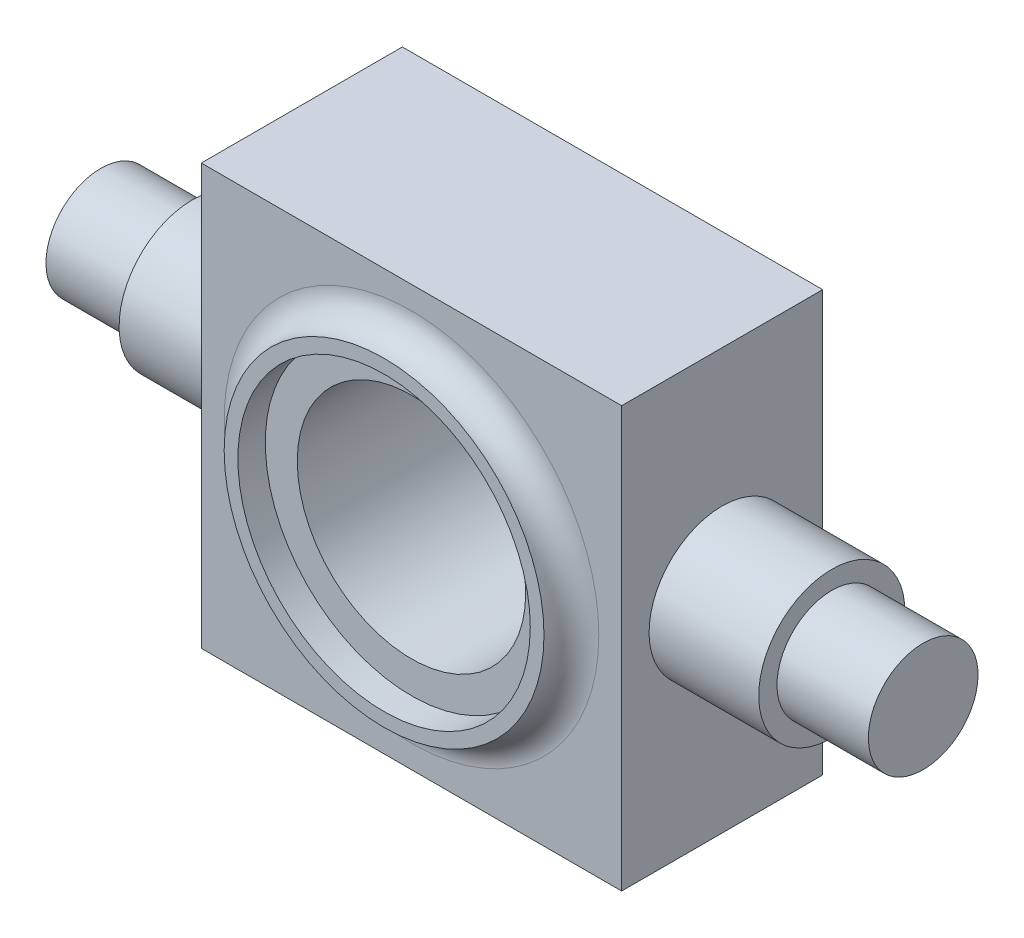
ISO-10303-21;
HEADER;
FILE_DESCRIPTION(('STEP AP214'),'2;1');
FILE_NAME('part.step','',(''),(''),'','','');
FILE_SCHEMA(('AUTOMOTIVE_DESIGN { 1 0 10303 214 1 1 1 1 }'));
ENDSEC;
DATA;
#1=APPLICATION_CONTEXT('core data for automotive mechanical design processes');
#2=APPLICATION_PROTOCOL_DEFINITION('international standard','automotive_design',2000,#1);
#3=PRODUCT_CONTEXT('',#1,'mechanical');
#4=PRODUCT('Part','Part','',(#3));
#5=PRODUCT_RELATED_PRODUCT_CATEGORY('part','',(#4));
#6=PRODUCT_DEFINITION_FORMATION('','',#4);
#7=PRODUCT_DEFINITION_CONTEXT('part definition',#1,'design');
#8=PRODUCT_DEFINITION('design','',#6,#7);
#9=PRODUCT_DEFINITION_SHAPE('','',#8);
#10=(LENGTH_UNIT() NAMED_UNIT(*) SI_UNIT(.MILLI.,.METRE.));
#11=(NAMED_UNIT(*) PLANE_ANGLE_UNIT() SI_UNIT($,.RADIAN.));
#12=(NAMED_UNIT(*) SI_UNIT($,.STERADIAN.) SOLID_ANGLE_UNIT());
#13=UNCERTAINTY_MEASURE_WITH_UNIT(LENGTH_MEASURE(1.E-05),#10,'distance_accuracy_value','');
#14=(GEOMETRIC_REPRESENTATION_CONTEXT(3) GLOBAL_UNCERTAINTY_ASSIGNED_CONTEXT((#13)) GLOBAL_UNIT_ASSIGNED_CONTEXT((#10,
#11,#12)) REPRESENTATION_CONTEXT('',''));
#15=CARTESIAN_POINT('',(0.,0.,0.));
#16=DIRECTION('',(0.,0.,1.));
#17=DIRECTION('',(1.,0.,0.));
#18=AXIS2_PLACEMENT_3D('',#15,#16,#17);
#19=CARTESIAN_POINT('',(0.,0.,-11.));
#20=DIRECTION('',(0.,0.,1.));
#21=DIRECTION('',(1.,0.,0.));
#22=AXIS2_PLACEMENT_3D('',#19,#20,#21);
#23=PLANE('',#22);
#24=CARTESIAN_POINT('',(0.,0.,-11.));
#25=DIRECTION('',(0.,0.,1.));
#26=DIRECTION('',(1.,0.,0.));
#27=AXIS2_PLACEMENT_3D('',#24,#25,#26);
#28=CIRCLE('',#27,12.5);
#29=CARTESIAN_POINT('',(12.5,0.,-11.));
#30=VERTEX_POINT('',#29);
#31=EDGE_CURVE('E186',#30,#30,#28,.T.);
#32=ORIENTED_EDGE('',*,*,#31,.T.);
#33=EDGE_LOOP('',(#32));
#34=FACE_BOUND('',#33,.T.);
#35=CARTESIAN_POINT('',(0.,0.,-11.));
#36=DIRECTION('',(0.,0.,1.));
#37=DIRECTION('',(1.,0.,0.));
#38=AXIS2_PLACEMENT_3D('',#35,#36,#37);
#39=CIRCLE('',#38,16.);
#40=CARTESIAN_POINT('',(16.,0.,-11.));
#41=VERTEX_POINT('',#40);
#42=EDGE_CURVE('E118',#41,#41,#39,.T.);
#43=ORIENTED_EDGE('',*,*,#42,.F.);
#44=EDGE_LOOP('',(#43));
#45=FACE_BOUND('',#44,.T.);
#46=ADVANCED_FACE('F37',(#34,#45),#23,.F.);
#47=CARTESIAN_POINT('',(0.,0.,11.));
#48=DIRECTION('',(0.,0.,1.));
#49=DIRECTION('',(1.,0.,0.));
#50=AXIS2_PLACEMENT_3D('',#47,#48,#49);
#51=PLANE('',#50);
#52=CARTESIAN_POINT('',(0.,0.,11.));
#53=DIRECTION('',(0.,0.,1.));
#54=DIRECTION('',(1.,0.,0.));
#55=AXIS2_PLACEMENT_3D('',#52,#53,#54);
#56=CIRCLE('',#55,20.5);
#57=CARTESIAN_POINT('',(20.5,0.,11.));
#58=VERTEX_POINT('',#57);
#59=EDGE_CURVE('E11',#58,#58,#56,.F.);
#60=ORIENTED_EDGE('',*,*,#59,.T.);
#61=EDGE_LOOP('',(#60));
#62=FACE_BOUND('',#61,.T.);
#63=DIRECTION('',(0.,1.,0.));
#64=VECTOR('',#63,1.);
#65=CARTESIAN_POINT('',(23.,23.,11.));
#66=LINE('',#65,#64);
#67=CARTESIAN_POINT('',(23.,-23.,11.));
#68=VERTEX_POINT('',#67);
#69=CARTESIAN_POINT('',(23.,23.,11.));
#70=VERTEX_POINT('',#69);
#71=EDGE_CURVE('E90',#68,#70,#66,.T.);
#72=ORIENTED_EDGE('',*,*,#71,.T.);
#73=DIRECTION('',(-1.,0.,0.));
#74=VECTOR('',#73,1.);
#75=CARTESIAN_POINT('',(-23.,23.,11.));
#76=LINE('',#75,#74);
#77=CARTESIAN_POINT('',(-23.,23.,11.));
#78=VERTEX_POINT('',#77);
#79=EDGE_CURVE('E85',#70,#78,#76,.T.);
#80=ORIENTED_EDGE('',*,*,#79,.T.);
#81=DIRECTION('',(0.,-1.,0.));
#82=VECTOR('',#81,1.);
#83=CARTESIAN_POINT('',(-23.,23.,11.));
#84=LINE('',#83,#82);
#85=CARTESIAN_POINT('',(-23.,-23.,11.));
#86=VERTEX_POINT('',#85);
#87=EDGE_CURVE('E88',#78,#86,#84,.T.);
#88=ORIENTED_EDGE('',*,*,#87,.T.);
#89=DIRECTION('',(1.,0.,0.));
#90=VECTOR('',#89,1.);
#91=CARTESIAN_POINT('',(-23.,-23.,11.));
#92=LINE('',#91,#90);
#93=EDGE_CURVE('E54',#86,#68,#92,.T.);
#94=ORIENTED_EDGE('',*,*,#93,.T.);
#95=EDGE_LOOP('',(#72,#80,#88,#94));
#96=FACE_BOUND('',#95,.T.);
#97=ADVANCED_FACE('F86',(#62,#96),#51,.T.);
#98=CARTESIAN_POINT('',(23.,23.,11.));
#99=DIRECTION('',(-1.,0.,0.));
#100=DIRECTION('',(0.,0.,1.));
#101=AXIS2_PLACEMENT_3D('',#98,#99,#100);
#102=PLANE('',#101);
#103=CARTESIAN_POINT('',(23.,0.,0.));
#104=DIRECTION('',(1.,0.,0.));
#105=DIRECTION('',(0.,1.,0.));
#106=AXIS2_PLACEMENT_3D('',#103,#104,#105);
#107=CIRCLE('',#106,8.);
#108=CARTESIAN_POINT('',(23.,8.,0.));
#109=VERTEX_POINT('',#108);
#110=EDGE_CURVE('E178',#109,#109,#107,.T.);
#111=ORIENTED_EDGE('',*,*,#110,.F.);
#112=EDGE_LOOP('',(#111));
#113=FACE_BOUND('',#112,.T.);
#114=DIRECTION('',(0.,1.,0.));
#115=VECTOR('',#114,1.);
#116=CARTESIAN_POINT('',(23.,23.,-11.));
#117=LINE('',#116,#115);
#118=CARTESIAN_POINT('',(23.,-23.,-11.));
#119=VERTEX_POINT('',#118);
#120=CARTESIAN_POINT('',(23.,23.,-11.));
#121=VERTEX_POINT('',#120);
#122=EDGE_CURVE('E105',#119,#121,#117,.T.);
#123=ORIENTED_EDGE('',*,*,#122,.T.);
#124=DIRECTION('',(0.,0.,-1.));
#125=VECTOR('',#124,1.);
#126=CARTESIAN_POINT('',(23.,23.,11.));
#127=LINE('',#126,#125);
#128=EDGE_CURVE('E96',#70,#121,#127,.T.);
#129=ORIENTED_EDGE('',*,*,#128,.F.);
#130=ORIENTED_EDGE('',*,*,#71,.F.);
#131=DIRECTION('',(0.,0.,-1.));
#132=VECTOR('',#131,1.);
#133=CARTESIAN_POINT('',(23.,-23.,11.));
#134=LINE('',#133,#132);
#135=EDGE_CURVE('E101',#68,#119,#134,.T.);
#136=ORIENTED_EDGE('',*,*,#135,.T.);
#137=EDGE_LOOP('',(#123,#129,#130,#136));
#138=FACE_BOUND('',#137,.T.);
#139=ADVANCED_FACE('F147',(#113,#138),#102,.F.);
#140=CARTESIAN_POINT('',(-23.,23.,11.));
#141=DIRECTION('',(0.,-1.,0.));
#142=DIRECTION('',(0.,0.,-1.));
#143=AXIS2_PLACEMENT_3D('',#140,#141,#142);
#144=PLANE('',#143);
#145=DIRECTION('',(-1.,0.,0.));
#146=VECTOR('',#145,1.);
#147=CARTESIAN_POINT('',(-23.,23.,-11.));
#148=LINE('',#147,#146);
#149=CARTESIAN_POINT('',(-23.,23.,-11.));
#150=VERTEX_POINT('',#149);
#151=EDGE_CURVE('E95',#121,#150,#148,.T.);
#152=ORIENTED_EDGE('',*,*,#151,.T.);
#153=DIRECTION('',(0.,0.,-1.));
#154=VECTOR('',#153,1.);
#155=CARTESIAN_POINT('',(-23.,23.,11.));
#156=LINE('',#155,#154);
#157=EDGE_CURVE('E93',#78,#150,#156,.T.);
#158=ORIENTED_EDGE('',*,*,#157,.F.);
#159=ORIENTED_EDGE('',*,*,#79,.F.);
#160=ORIENTED_EDGE('',*,*,#128,.T.);
#161=EDGE_LOOP('',(#152,#158,#159,#160));
#162=FACE_BOUND('',#161,.T.);
#163=ADVANCED_FACE('F94',(#162),#144,.F.);
#164=CARTESIAN_POINT('',(-23.,23.,11.));
#165=DIRECTION('',(1.,0.,0.));
#166=DIRECTION('',(0.,1.,0.));
#167=AXIS2_PLACEMENT_3D('',#164,#165,#166);
#168=PLANE('',#167);
#169=CARTESIAN_POINT('',(-23.,0.,0.));
#170=DIRECTION('',(1.,0.,0.));
#171=DIRECTION('',(0.,1.,0.));
#172=AXIS2_PLACEMENT_3D('',#169,#170,#171);
#173=CIRCLE('',#172,8.);
#174=CARTESIAN_POINT('',(-23.,8.,0.));
#175=VERTEX_POINT('',#174);
#176=EDGE_CURVE('E196',#175,#175,#173,.T.);
#177=ORIENTED_EDGE('',*,*,#176,.T.);
#178=EDGE_LOOP('',(#177));
#179=FACE_BOUND('',#178,.T.);
#180=DIRECTION('',(0.,-1.,0.));
#181=VECTOR('',#180,1.);
#182=CARTESIAN_POINT('',(-23.,23.,-11.));
#183=LINE('',#182,#181);
#184=CARTESIAN_POINT('',(-23.,-23.,-11.));
#185=VERTEX_POINT('',#184);
#186=EDGE_CURVE('E71',#150,#185,#183,.T.);
#187=ORIENTED_EDGE('',*,*,#186,.T.);
#188=DIRECTION('',(0.,0.,-1.));
#189=VECTOR('',#188,1.);
#190=CARTESIAN_POINT('',(-23.,-23.,11.));
#191=LINE('',#190,#189);
#192=EDGE_CURVE('E97',#86,#185,#191,.T.);
#193=ORIENTED_EDGE('',*,*,#192,.F.);
#194=ORIENTED_EDGE('',*,*,#87,.F.);
#195=ORIENTED_EDGE('',*,*,#157,.T.);
#196=EDGE_LOOP('',(#187,#193,#194,#195));
#197=FACE_BOUND('',#196,.T.);
#198=ADVANCED_FACE('F99',(#179,#197),#168,.F.);
#199=CARTESIAN_POINT('',(-23.,-23.,11.));
#200=DIRECTION('',(0.,1.,0.));
#201=DIRECTION('',(0.,0.,1.));
#202=AXIS2_PLACEMENT_3D('',#199,#200,#201);
#203=PLANE('',#202);
#204=DIRECTION('',(1.,0.,0.));
#205=VECTOR('',#204,1.);
#206=CARTESIAN_POINT('',(-23.,-23.,-11.));
#207=LINE('',#206,#205);
#208=EDGE_CURVE('E77',#185,#119,#207,.T.);
#209=ORIENTED_EDGE('',*,*,#208,.T.);
#210=ORIENTED_EDGE('',*,*,#135,.F.);
#211=ORIENTED_EDGE('',*,*,#93,.F.);
#212=ORIENTED_EDGE('',*,*,#192,.T.);
#213=EDGE_LOOP('',(#209,#210,#211,#212));
#214=FACE_BOUND('',#213,.T.);
#215=ADVANCED_FACE('F156',(#214),#203,.F.);
#216=CARTESIAN_POINT('',(0.,0.,-11.));
#217=DIRECTION('',(0.,0.,1.));
#218=DIRECTION('',(1.,0.,0.));
#219=AXIS2_PLACEMENT_3D('',#216,#217,#218);
#220=CIRCLE('',#219,20.5);
#221=CARTESIAN_POINT('',(20.5,0.,-11.));
#222=VERTEX_POINT('',#221);
#223=EDGE_CURVE('E46',#222,#222,#220,.T.);
#224=ORIENTED_EDGE('',*,*,#223,.T.);
#225=EDGE_LOOP('',(#224));
#226=FACE_BOUND('',#225,.T.);
#227=ORIENTED_EDGE('',*,*,#122,.F.);
#228=ORIENTED_EDGE('',*,*,#208,.F.);
#229=ORIENTED_EDGE('',*,*,#186,.F.);
#230=ORIENTED_EDGE('',*,*,#151,.F.);
#231=EDGE_LOOP('',(#227,#228,#229,#230));
#232=FACE_BOUND('',#231,.T.);
#233=ADVANCED_FACE('F123',(#226,#232),#23,.F.);
#234=CARTESIAN_POINT('',(0.,0.,14.));
#235=DIRECTION('',(0.,0.,1.));
#236=DIRECTION('',(1.,0.,0.));
#237=AXIS2_PLACEMENT_3D('',#234,#235,#236);
#238=PLANE('',#237);
#239=CARTESIAN_POINT('',(0.,0.,14.));
#240=DIRECTION('',(0.,0.,1.));
#241=DIRECTION('',(1.,0.,0.));
#242=AXIS2_PLACEMENT_3D('',#239,#240,#241);
#243=CIRCLE('',#242,17.5);
#244=CARTESIAN_POINT('',(17.5,0.,14.));
#245=VERTEX_POINT('',#244);
#246=EDGE_CURVE('E108',#245,#245,#243,.T.);
#247=ORIENTED_EDGE('',*,*,#246,.T.);
#248=EDGE_LOOP('',(#247));
#249=FACE_BOUND('',#248,.T.);
#250=CARTESIAN_POINT('',(0.,0.,14.));
#251=DIRECTION('',(0.,0.,1.));
#252=DIRECTION('',(1.,0.,0.));
#253=AXIS2_PLACEMENT_3D('',#250,#251,#252);
#254=CIRCLE('',#253,16.);
#255=CARTESIAN_POINT('',(16.,0.,14.));
#256=VERTEX_POINT('',#255);
#257=EDGE_CURVE('E183',#256,#256,#254,.T.);
#258=ORIENTED_EDGE('',*,*,#257,.F.);
#259=EDGE_LOOP('',(#258));
#260=FACE_BOUND('',#259,.T.);
#261=ADVANCED_FACE('F155',(#249,#260),#238,.T.);
#262=CARTESIAN_POINT('',(0.,0.,14.));
#263=DIRECTION('',(0.,0.,-1.));
#264=DIRECTION('',(-1.,0.,0.));
#265=AXIS2_PLACEMENT_3D('',#262,#263,#264);
#266=CYLINDRICAL_SURFACE('',#265,16.);
#267=ORIENTED_EDGE('',*,*,#257,.T.);
#268=EDGE_LOOP('',(#267));
#269=FACE_BOUND('',#268,.T.);
#270=CARTESIAN_POINT('',(0.,0.,11.));
#271=DIRECTION('',(0.,0.,1.));
#272=DIRECTION('',(1.,0.,0.));
#273=AXIS2_PLACEMENT_3D('',#270,#271,#272);
#274=CIRCLE('',#273,16.);
#275=CARTESIAN_POINT('',(16.,0.,11.));
#276=VERTEX_POINT('',#275);
#277=EDGE_CURVE('E115',#276,#276,#274,.F.);
#278=ORIENTED_EDGE('',*,*,#277,.T.);
#279=EDGE_LOOP('',(#278));
#280=FACE_BOUND('',#279,.T.);
#281=ADVANCED_FACE('F161',(#269,#280),#266,.F.);
#282=CARTESIAN_POINT('',(0.,0.,11.));
#283=DIRECTION('',(0.,0.,1.));
#284=DIRECTION('',(1.,0.,0.));
#285=AXIS2_PLACEMENT_3D('',#282,#283,#284);
#286=CIRCLE('',#285,12.5);
#287=CARTESIAN_POINT('',(12.5,0.,11.));
#288=VERTEX_POINT('',#287);
#289=EDGE_CURVE('E187',#288,#288,#286,.T.);
#290=ORIENTED_EDGE('',*,*,#289,.F.);
#291=EDGE_LOOP('',(#290));
#292=FACE_BOUND('',#291,.T.);
#293=ORIENTED_EDGE('',*,*,#277,.F.);
#294=EDGE_LOOP('',(#293));
#295=FACE_BOUND('',#294,.T.);
#296=ADVANCED_FACE('F150',(#292,#295),#51,.T.);
#297=CARTESIAN_POINT('',(0.,0.,-11.));
#298=DIRECTION('',(0.,0.,1.));
#299=DIRECTION('',(1.,0.,0.));
#300=AXIS2_PLACEMENT_3D('',#297,#298,#299);
#301=CYLINDRICAL_SURFACE('',#300,12.5);
#302=ORIENTED_EDGE('',*,*,#31,.F.);
#303=EDGE_LOOP('',(#302));
#304=FACE_BOUND('',#303,.T.);
#305=ORIENTED_EDGE('',*,*,#289,.T.);
#306=EDGE_LOOP('',(#305));
#307=FACE_BOUND('',#306,.T.);
#308=ADVANCED_FACE('F257',(#304,#307),#301,.F.);
#309=CARTESIAN_POINT('',(0.,0.,-14.));
#310=DIRECTION('',(0.,0.,-1.));
#311=DIRECTION('',(1.,0.,0.));
#312=AXIS2_PLACEMENT_3D('',#309,#310,#311);
#313=PLANE('',#312);
#314=CARTESIAN_POINT('',(0.,0.,-14.));
#315=DIRECTION('',(0.,0.,1.));
#316=DIRECTION('',(1.,0.,0.));
#317=AXIS2_PLACEMENT_3D('',#314,#315,#316);
#318=CIRCLE('',#317,16.);
#319=CARTESIAN_POINT('',(16.,0.,-14.));
#320=VERTEX_POINT('',#319);
#321=EDGE_CURVE('E193',#320,#320,#318,.T.);
#322=ORIENTED_EDGE('',*,*,#321,.T.);
#323=EDGE_LOOP('',(#322));
#324=FACE_BOUND('',#323,.T.);
#325=CARTESIAN_POINT('',(0.,0.,-14.));
#326=DIRECTION('',(0.,0.,1.));
#327=DIRECTION('',(1.,0.,0.));
#328=AXIS2_PLACEMENT_3D('',#325,#326,#327);
#329=CIRCLE('',#328,17.5);
#330=CARTESIAN_POINT('',(17.5,0.,-14.));
#331=VERTEX_POINT('',#330);
#332=EDGE_CURVE('E190',#331,#331,#329,.T.);
#333=ORIENTED_EDGE('',*,*,#332,.F.);
#334=EDGE_LOOP('',(#333));
#335=FACE_BOUND('',#334,.T.);
#336=ADVANCED_FACE('F136',(#324,#335),#313,.T.);
#337=CARTESIAN_POINT('',(0.,0.,-14.));
#338=DIRECTION('',(0.,0.,1.));
#339=DIRECTION('',(1.,0.,0.));
#340=AXIS2_PLACEMENT_3D('',#337,#338,#339);
#341=CYLINDRICAL_SURFACE('',#340,16.);
#342=ORIENTED_EDGE('',*,*,#321,.F.);
#343=EDGE_LOOP('',(#342));
#344=FACE_BOUND('',#343,.T.);
#345=ORIENTED_EDGE('',*,*,#42,.T.);
#346=EDGE_LOOP('',(#345));
#347=FACE_BOUND('',#346,.T.);
#348=ADVANCED_FACE('F128',(#344,#347),#341,.F.);
#349=CARTESIAN_POINT('',(0.,0.,-14.));
#350=DIRECTION('',(0.,0.,1.));
#351=DIRECTION('',(1.,0.,0.));
#352=AXIS2_PLACEMENT_3D('',#349,#350,#351);
#353=TOROIDAL_SURFACE('',#352,20.5,3.);
#354=ORIENTED_EDGE('',*,*,#332,.T.);
#355=EDGE_LOOP('',(#354));
#356=FACE_BOUND('',#355,.T.);
#357=ORIENTED_EDGE('',*,*,#223,.F.);
#358=EDGE_LOOP('',(#357));
#359=FACE_BOUND('',#358,.T.);
#360=ADVANCED_FACE('F126',(#356,#359),#353,.F.);
#361=CARTESIAN_POINT('',(0.,0.,14.));
#362=DIRECTION('',(0.,0.,1.));
#363=DIRECTION('',(1.,0.,0.));
#364=AXIS2_PLACEMENT_3D('',#361,#362,#363);
#365=TOROIDAL_SURFACE('',#364,20.5,3.);
#366=ORIENTED_EDGE('',*,*,#59,.F.);
#367=EDGE_LOOP('',(#366));
#368=FACE_BOUND('',#367,.T.);
#369=ORIENTED_EDGE('',*,*,#246,.F.);
#370=EDGE_LOOP('',(#369));
#371=FACE_BOUND('',#370,.T.);
#372=ADVANCED_FACE('F39',(#368,#371),#365,.F.);
#373=CARTESIAN_POINT('',(-23.,0.,0.));
#374=DIRECTION('',(1.,0.,0.));
#375=DIRECTION('',(0.,1.,0.));
#376=AXIS2_PLACEMENT_3D('',#373,#374,#375);
#377=CYLINDRICAL_SURFACE('',#376,8.);
#378=CARTESIAN_POINT('',(-35.,0.,0.));
#379=DIRECTION('',(1.,0.,0.));
#380=DIRECTION('',(0.,1.,0.));
#381=AXIS2_PLACEMENT_3D('',#378,#379,#380);
#382=CIRCLE('',#381,8.);
#383=CARTESIAN_POINT('',(-35.,8.,0.));
#384=VERTEX_POINT('',#383);
#385=EDGE_CURVE('E199',#384,#384,#382,.T.);
#386=ORIENTED_EDGE('',*,*,#385,.T.);
#387=EDGE_LOOP('',(#386));
#388=FACE_BOUND('',#387,.T.);
#389=ORIENTED_EDGE('',*,*,#176,.F.);
#390=EDGE_LOOP('',(#389));
#391=FACE_BOUND('',#390,.T.);
#392=ADVANCED_FACE('F134',(#388,#391),#377,.T.);
#393=CARTESIAN_POINT('',(-35.,8.,0.));
#394=DIRECTION('',(-1.,0.,0.));
#395=DIRECTION('',(0.,-1.,0.));
#396=AXIS2_PLACEMENT_3D('',#393,#394,#395);
#397=PLANE('',#396);
#398=CARTESIAN_POINT('',(-35.,0.,0.));
#399=DIRECTION('',(1.,0.,0.));
#400=DIRECTION('',(0.,1.,0.));
#401=AXIS2_PLACEMENT_3D('',#398,#399,#400);
#402=CIRCLE('',#401,6.);
#403=CARTESIAN_POINT('',(-35.,6.,0.));
#404=VERTEX_POINT('',#403);
#405=EDGE_CURVE('E202',#404,#404,#402,.T.);
#406=ORIENTED_EDGE('',*,*,#405,.T.);
#407=EDGE_LOOP('',(#406));
#408=FACE_BOUND('',#407,.T.);
#409=ORIENTED_EDGE('',*,*,#385,.F.);
#410=EDGE_LOOP('',(#409));
#411=FACE_BOUND('',#410,.T.);
#412=ADVANCED_FACE('F247',(#408,#411),#397,.T.);
#413=CARTESIAN_POINT('',(-23.,0.,0.));
#414=DIRECTION('',(1.,0.,0.));
#415=DIRECTION('',(0.,1.,0.));
#416=AXIS2_PLACEMENT_3D('',#413,#414,#415);
#417=CYLINDRICAL_SURFACE('',#416,6.);
#418=CARTESIAN_POINT('',(-45.,0.,0.));
#419=DIRECTION('',(1.,0.,0.));
#420=DIRECTION('',(0.,1.,0.));
#421=AXIS2_PLACEMENT_3D('',#418,#419,#420);
#422=CIRCLE('',#421,6.);
#423=CARTESIAN_POINT('',(-45.,6.,0.));
#424=VERTEX_POINT('',#423);
#425=EDGE_CURVE('E205',#424,#424,#422,.T.);
#426=ORIENTED_EDGE('',*,*,#425,.T.);
#427=EDGE_LOOP('',(#426));
#428=FACE_BOUND('',#427,.T.);
#429=ORIENTED_EDGE('',*,*,#405,.F.);
#430=EDGE_LOOP('',(#429));
#431=FACE_BOUND('',#430,.T.);
#432=ADVANCED_FACE('F241',(#428,#431),#417,.T.);
#433=CARTESIAN_POINT('',(-45.,6.,0.));
#434=DIRECTION('',(-1.,0.,0.));
#435=DIRECTION('',(0.,-1.,0.));
#436=AXIS2_PLACEMENT_3D('',#433,#434,#435);
#437=PLANE('',#436);
#438=ORIENTED_EDGE('',*,*,#425,.F.);
#439=EDGE_LOOP('',(#438));
#440=FACE_BOUND('',#439,.T.);
#441=ADVANCED_FACE('F236',(#440),#437,.T.);
#442=CARTESIAN_POINT('',(23.,0.,0.));
#443=DIRECTION('',(-1.,0.,0.));
#444=DIRECTION('',(0.,1.,0.));
#445=AXIS2_PLACEMENT_3D('',#442,#443,#444);
#446=CYLINDRICAL_SURFACE('',#445,8.);
#447=CARTESIAN_POINT('',(35.,0.,0.));
#448=DIRECTION('',(1.,0.,0.));
#449=DIRECTION('',(0.,1.,0.));
#450=AXIS2_PLACEMENT_3D('',#447,#448,#449);
#451=CIRCLE('',#450,8.);
#452=CARTESIAN_POINT('',(35.,8.,0.));
#453=VERTEX_POINT('',#452);
#454=EDGE_CURVE('E209',#453,#453,#451,.T.);
#455=ORIENTED_EDGE('',*,*,#454,.F.);
#456=EDGE_LOOP('',(#455));
#457=FACE_BOUND('',#456,.T.);
#458=ORIENTED_EDGE('',*,*,#110,.T.);
#459=EDGE_LOOP('',(#458));
#460=FACE_BOUND('',#459,.T.);
#461=ADVANCED_FACE('F230',(#457,#460),#446,.T.);
#462=CARTESIAN_POINT('',(35.,8.,0.));
#463=DIRECTION('',(1.,0.,0.));
#464=DIRECTION('',(0.,-1.,0.));
#465=AXIS2_PLACEMENT_3D('',#462,#463,#464);
#466=PLANE('',#465);
#467=CARTESIAN_POINT('',(35.,0.,0.));
#468=DIRECTION('',(1.,0.,0.));
#469=DIRECTION('',(0.,1.,0.));
#470=AXIS2_PLACEMENT_3D('',#467,#468,#469);
#471=CIRCLE('',#470,6.);
#472=CARTESIAN_POINT('',(35.,6.,0.));
#473=VERTEX_POINT('',#472);
#474=EDGE_CURVE('E212',#473,#473,#471,.T.);
#475=ORIENTED_EDGE('',*,*,#474,.F.);
#476=EDGE_LOOP('',(#475));
#477=FACE_BOUND('',#476,.T.);
#478=ORIENTED_EDGE('',*,*,#454,.T.);
#479=EDGE_LOOP('',(#478));
#480=FACE_BOUND('',#479,.T.);
#481=ADVANCED_FACE('F224',(#477,#480),#466,.T.);
#482=CARTESIAN_POINT('',(23.,0.,0.));
#483=DIRECTION('',(-1.,0.,0.));
#484=DIRECTION('',(0.,1.,0.));
#485=AXIS2_PLACEMENT_3D('',#482,#483,#484);
#486=CYLINDRICAL_SURFACE('',#485,6.);
#487=CARTESIAN_POINT('',(45.,0.,0.));
#488=DIRECTION('',(1.,0.,0.));
#489=DIRECTION('',(0.,1.,0.));
#490=AXIS2_PLACEMENT_3D('',#487,#488,#489);
#491=CIRCLE('',#490,6.);
#492=CARTESIAN_POINT('',(45.,6.,0.));
#493=VERTEX_POINT('',#492);
#494=EDGE_CURVE('E215',#493,#493,#491,.T.);
#495=ORIENTED_EDGE('',*,*,#494,.F.);
#496=EDGE_LOOP('',(#495));
#497=FACE_BOUND('',#496,.T.);
#498=ORIENTED_EDGE('',*,*,#474,.T.);
#499=EDGE_LOOP('',(#498));
#500=FACE_BOUND('',#499,.T.);
#501=ADVANCED_FACE('F221',(#497,#500),#486,.T.);
#502=CARTESIAN_POINT('',(45.,6.,0.));
#503=DIRECTION('',(1.,0.,0.));
#504=DIRECTION('',(0.,-1.,0.));
#505=AXIS2_PLACEMENT_3D('',#502,#503,#504);
#506=PLANE('',#505);
#507=ORIENTED_EDGE('',*,*,#494,.T.);
#508=EDGE_LOOP('',(#507));
#509=FACE_BOUND('',#508,.T.);
#510=ADVANCED_FACE('F219',(#509),#506,.T.);
#511=CLOSED_SHELL('',(#46,#97,#139,#163,#198,#215,#233,#261,#281,#296,#308,#336,#348,#360,#372,
#392,#412,#432,#441,#461,#481,#501,#510));
#512=MANIFOLD_SOLID_BREP('B2',#511);
#513=ADVANCED_BREP_SHAPE_REPRESENTATION('',(#18,#512),#14);
#514=SHAPE_DEFINITION_REPRESENTATION(#9,#513);
ENDSEC;
END-ISO-10303-21;
